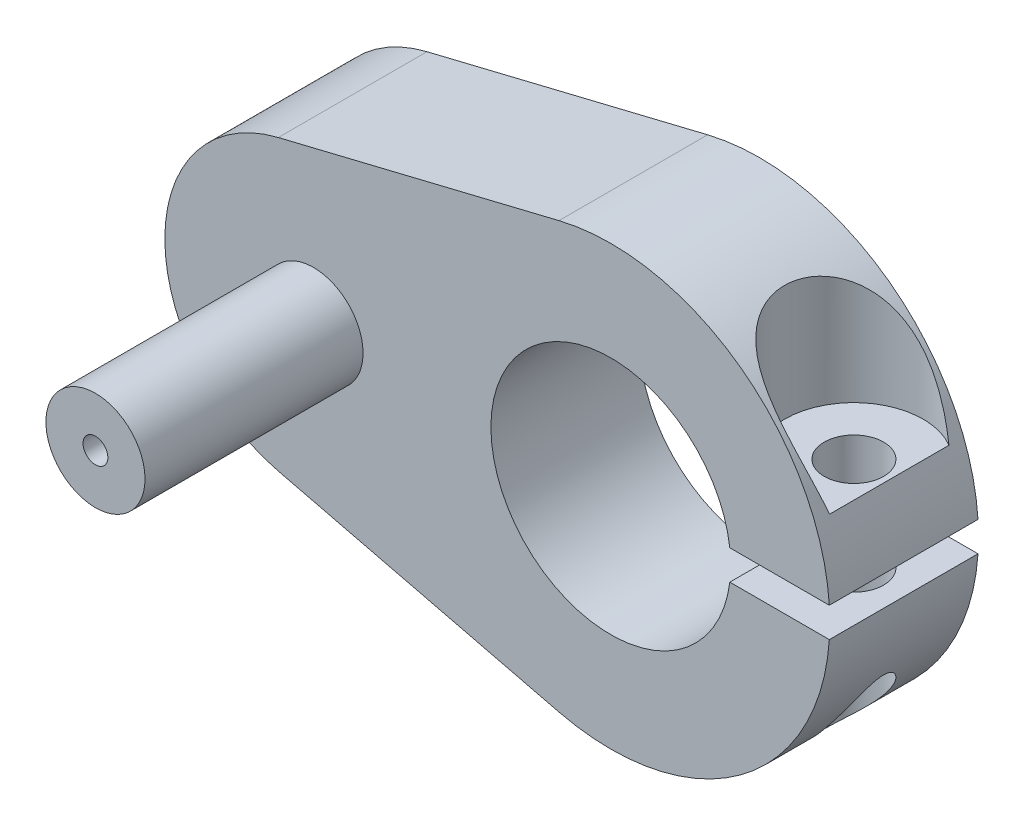
ISO-10303-21;
HEADER;
FILE_DESCRIPTION(('STEP AP214'),'2;1');
FILE_NAME('part.step','',(''),(''),'','','');
FILE_SCHEMA(('AUTOMOTIVE_DESIGN { 1 0 10303 214 1 1 1 1 }'));
ENDSEC;
DATA;
#1=APPLICATION_CONTEXT('core data for automotive mechanical design processes');
#2=APPLICATION_PROTOCOL_DEFINITION('international standard','automotive_design',2000,#1);
#3=PRODUCT_CONTEXT('',#1,'mechanical');
#4=PRODUCT('Part','Part','',(#3));
#5=PRODUCT_RELATED_PRODUCT_CATEGORY('part','',(#4));
#6=PRODUCT_DEFINITION_FORMATION('','',#4);
#7=PRODUCT_DEFINITION_CONTEXT('part definition',#1,'design');
#8=PRODUCT_DEFINITION('design','',#6,#7);
#9=PRODUCT_DEFINITION_SHAPE('','',#8);
#10=(LENGTH_UNIT() NAMED_UNIT(*) SI_UNIT(.MILLI.,.METRE.));
#11=(NAMED_UNIT(*) PLANE_ANGLE_UNIT() SI_UNIT($,.RADIAN.));
#12=(NAMED_UNIT(*) SI_UNIT($,.STERADIAN.) SOLID_ANGLE_UNIT());
#13=UNCERTAINTY_MEASURE_WITH_UNIT(LENGTH_MEASURE(1.E-05),#10,'distance_accuracy_value','');
#14=(GEOMETRIC_REPRESENTATION_CONTEXT(3) GLOBAL_UNCERTAINTY_ASSIGNED_CONTEXT((#13)) GLOBAL_UNIT_ASSIGNED_CONTEXT((#10,
#11,#12)) REPRESENTATION_CONTEXT('',''));
#15=CARTESIAN_POINT('',(0.,0.,0.));
#16=DIRECTION('',(0.,0.,1.));
#17=DIRECTION('',(1.,0.,0.));
#18=AXIS2_PLACEMENT_3D('',#15,#16,#17);
#19=CARTESIAN_POINT('',(0.,0.,-7.5));
#20=DIRECTION('',(0.,0.,1.));
#21=DIRECTION('',(1.,0.,0.));
#22=AXIS2_PLACEMENT_3D('',#19,#20,#21);
#23=CYLINDRICAL_SURFACE('',#22,11.05);
#24=CARTESIAN_POINT('',(0.,0.,0.));
#25=DIRECTION('',(0.,0.,1.));
#26=DIRECTION('',(1.,0.,0.));
#27=AXIS2_PLACEMENT_3D('',#24,#25,#26);
#28=CIRCLE('',#27,11.05);
#29=CARTESIAN_POINT('',(11.024518130059,0.75,0.));
#30=VERTEX_POINT('',#29);
#31=CARTESIAN_POINT('',(-2.61516666666667,10.7360795128182,0.));
#32=VERTEX_POINT('',#31);
#33=EDGE_CURVE('E169',#30,#32,#28,.T.);
#34=ORIENTED_EDGE('',*,*,#33,.F.);
#35=DIRECTION('',(0.,0.,1.));
#36=VECTOR('',#35,1.);
#37=CARTESIAN_POINT('',(11.024518130059,0.75,-7.5));
#38=LINE('',#37,#36);
#39=CARTESIAN_POINT('',(11.024518130059,0.75,-7.5));
#40=VERTEX_POINT('',#39);
#41=EDGE_CURVE('E60',#30,#40,#38,.F.);
#42=ORIENTED_EDGE('',*,*,#41,.T.);
#43=CARTESIAN_POINT('',(0.,0.,-7.5));
#44=DIRECTION('',(0.,0.,1.));
#45=DIRECTION('',(1.,0.,0.));
#46=AXIS2_PLACEMENT_3D('',#43,#44,#45);
#47=CIRCLE('',#46,11.05);
#48=CARTESIAN_POINT('',(-2.61516666666667,10.7360795128182,-7.5));
#49=VERTEX_POINT('',#48);
#50=EDGE_CURVE('E195',#40,#49,#47,.T.);
#51=ORIENTED_EDGE('',*,*,#50,.T.);
#52=DIRECTION('',(0.,0.,1.));
#53=VECTOR('',#52,1.);
#54=CARTESIAN_POINT('',(-2.61516666666667,10.7360795128182,-7.5));
#55=LINE('',#54,#53);
#56=EDGE_CURVE('E183',#49,#32,#55,.T.);
#57=ORIENTED_EDGE('',*,*,#56,.T.);
#58=EDGE_LOOP('',(#34,#42,#51,#57));
#59=FACE_BOUND('',#58,.T.);
#60=DIRECTION('',(0.,0.,1.));
#61=VECTOR('',#60,1.);
#62=CARTESIAN_POINT('',(10.3006067782437,4.,-7.5));
#63=LINE('',#62,#61);
#64=CARTESIAN_POINT('',(10.3006067782437,4.,-6.7596127964394));
#65=VERTEX_POINT('',#64);
#66=CARTESIAN_POINT('',(10.3006067782437,4.,-0.740387203560602));
#67=VERTEX_POINT('',#66);
#68=EDGE_CURVE('E46',#65,#67,#63,.T.);
#69=ORIENTED_EDGE('',*,*,#68,.T.);
#70=CARTESIAN_POINT('',(10.3006067782437,4.,-0.740387203560602));
#71=CARTESIAN_POINT('',(10.1963332133419,4.26846772193375,-0.678501030928572));
#72=CARTESIAN_POINT('',(10.0814411251191,4.53327440323441,-0.617619088764549));
#73=CARTESIAN_POINT('',(9.82985169091135,5.05580385530931,-0.503841767188244));
#74=CARTESIAN_POINT('',(9.69304533873154,5.31348323649118,-0.450989031556256));
#75=CARTESIAN_POINT('',(9.39590293925441,5.82303649722511,-0.35932622223754));
#76=CARTESIAN_POINT('',(9.23524249715496,6.07476375728232,-0.320740477228709));
#77=CARTESIAN_POINT('',(8.89295101377397,6.56559231672235,-0.266282914234312));
#78=CARTESIAN_POINT('',(8.71137387197074,6.80472385232601,-0.25035406774733));
#79=CARTESIAN_POINT('',(8.43314136231223,7.14167205303236,-0.249846946722727));
#80=CARTESIAN_POINT('',(8.3439220457835,7.24570367798232,-0.252940572722385));
#81=CARTESIAN_POINT('',(8.16190395445752,7.45013614310722,-0.266551538705841));
#82=CARTESIAN_POINT('',(8.06910500083609,7.55053680140705,-0.277069250022111));
#83=CARTESIAN_POINT('',(7.88076425074714,7.74690321355485,-0.306431892805582));
#84=CARTESIAN_POINT('',(7.78523166885842,7.84288154329846,-0.325251364816527));
#85=CARTESIAN_POINT('',(7.59190250630063,8.03016934689135,-0.3721656336608));
#86=CARTESIAN_POINT('',(7.49410641729134,8.12147982107978,-0.400258433479962));
#87=CARTESIAN_POINT('',(7.29575109574714,8.3001558566418,-0.467141062808042));
#88=CARTESIAN_POINT('',(7.19517237176104,8.38744406940937,-0.506081512330807));
#89=CARTESIAN_POINT('',(6.99393994896175,8.55596442917005,-0.595358858012029));
#90=CARTESIAN_POINT('',(6.89328624371162,8.63719597573479,-0.645696882078924));
#91=CARTESIAN_POINT('',(6.69364662735271,8.79281421398746,-0.758395829694695));
#92=CARTESIAN_POINT('',(6.59465854785767,8.86721047630164,-0.820739552134213));
#93=CARTESIAN_POINT('',(6.40015252285975,9.00860797277195,-0.957845181539791));
#94=CARTESIAN_POINT('',(6.30463287298117,9.07561287293522,-1.03260088583298));
#95=CARTESIAN_POINT('',(6.08362264050598,9.22583289205448,-1.22561226802914));
#96=CARTESIAN_POINT('',(5.96059902113282,9.30548119947955,-1.34958347334033));
#97=CARTESIAN_POINT('',(5.73100907724234,9.44861968557136,-1.6200173574957));
#98=CARTESIAN_POINT('',(5.62443597922442,9.51211652161988,-1.76647072950087));
#99=CARTESIAN_POINT('',(5.43293351052162,9.62278824530146,-2.0793048208288));
#100=CARTESIAN_POINT('',(5.3480799223035,9.66990618393145,-2.24575241371878));
#101=CARTESIAN_POINT('',(5.20520591760782,9.74756424783843,-2.59341839723659));
#102=CARTESIAN_POINT('',(5.14718299691194,9.77810592029388,-2.77463540751517));
#103=CARTESIAN_POINT('',(5.06387890662484,9.82149162015357,-3.13428554996573));
#104=CARTESIAN_POINT('',(5.03676941172862,9.83532713994846,-3.31217805211246));
#105=CARTESIAN_POINT('',(5.01022063454891,9.84887949976952,-3.67053401850726));
#106=CARTESIAN_POINT('',(5.01077603849675,9.84859905113718,-3.85099698237363));
#107=CARTESIAN_POINT('',(5.03918879056605,9.83408897566568,-4.20499535856626));
#108=CARTESIAN_POINT('',(5.06641984652411,9.82017933385366,-4.37859473659775));
#109=CARTESIAN_POINT('',(5.14599291325295,9.77871414784651,-4.7182170532735));
#110=CARTESIAN_POINT('',(5.19833279112503,9.7511597627139,-4.88424063414125));
#111=CARTESIAN_POINT('',(5.32603063731056,9.68200195100669,-5.20509446535952));
#112=CARTESIAN_POINT('',(5.40150931925267,9.64032472339426,-5.35986061904781));
#113=CARTESIAN_POINT('',(5.57184890790361,9.54288171385813,-5.65341745984955));
#114=CARTESIAN_POINT('',(5.66671095155563,9.48711510546761,-5.79220720911013));
#115=CARTESIAN_POINT('',(5.87534867131825,9.35939322163919,-6.05591147582207));
#116=CARTESIAN_POINT('',(5.98969819133461,9.28691134478283,-6.18011464176932));
#117=CARTESIAN_POINT('',(6.22947029469755,9.12780889620242,-6.4067878500048));
#118=CARTESIAN_POINT('',(6.35489605495274,9.04118426193879,-6.50925162809905));
#119=CARTESIAN_POINT('',(6.62429550648337,8.84598471515737,-6.70114194710916));
#120=CARTESIAN_POINT('',(6.76888968032143,8.73609699201461,-6.7883481655234));
#121=CARTESIAN_POINT('',(7.05987127774445,8.50267820789095,-6.93787267194385));
#122=CARTESIAN_POINT('',(7.20625962242817,8.37913985361127,-7.00017757272748));
#123=CARTESIAN_POINT('',(7.46349092176918,8.14993513610026,-7.09076897097035));
#124=CARTESIAN_POINT('',(7.57485954329306,8.04657750483244,-7.12356711666247));
#125=CARTESIAN_POINT('',(7.794715528216,7.8337928344841,-7.17717714277757));
#126=CARTESIAN_POINT('',(7.90320158907403,7.72436311833917,-7.19798368956093));
#127=CARTESIAN_POINT('',(8.11638931994332,7.50004843862677,-7.22902234389072));
#128=CARTESIAN_POINT('',(8.22108272337062,7.38515268936556,-7.2392325536804));
#129=CARTESIAN_POINT('',(8.42574490852837,7.15077279912297,-7.25038986440645));
#130=CARTESIAN_POINT('',(8.52571211831591,7.03128715515094,-7.25133390466563));
#131=CARTESIAN_POINT('',(8.77086307595103,6.72534635388551,-7.24368884936215));
#132=CARTESIAN_POINT('',(8.91263295136968,6.53627396664622,-7.22990604104272));
#133=CARTESIAN_POINT('',(9.18312318512603,6.15047541807691,-7.18815565662202));
#134=CARTESIAN_POINT('',(9.31183517561927,5.95374445925848,-7.16017905279757));
#135=CARTESIAN_POINT('',(9.55576161986383,5.55380919763809,-7.09373342122582));
#136=CARTESIAN_POINT('',(9.67097392013578,5.35060386859849,-7.05526272270235));
#137=CARTESIAN_POINT('',(9.88771646830462,4.93859582294843,-6.97121026519316));
#138=CARTESIAN_POINT('',(9.98925310963832,4.72979577701865,-6.92563185075538));
#139=CARTESIAN_POINT('',(10.1223478427757,4.43276282678958,-6.85882957183692));
#140=CARTESIAN_POINT('',(10.1596120414864,4.34667422091004,-6.83924160879398));
#141=CARTESIAN_POINT('',(10.2318199398004,4.17385990654398,-6.79967685392041));
#142=CARTESIAN_POINT('',(10.2667687701623,4.08713611435178,-6.77970105795282));
#143=CARTESIAN_POINT('',(10.3006067782437,4.,-6.7596127964394));
#144=B_SPLINE_CURVE_WITH_KNOTS('',3,(#70,#71,#72,#73,#74,#75,#76,#77,#78,#79,#80,#81,#82,#83,
#84,#85,#86,#87,#88,#89,#90,#91,#92,#93,#94,#95,#96,#97,#98,#99,#100,#101,#102,#103,#104,#105,
#106,#107,#108,#109,#110,#111,#112,#113,#114,#115,#116,#117,#118,#119,#120,#121,#122,#123,#124,
#125,#126,#127,#128,#129,#130,#131,#132,#133,#134,#135,#136,#137,#138,#139,#140,#141,#142,#143),
.UNSPECIFIED.,.F.,.F.,(4,2,2,2,2,2,2,2,2,2,2,2,2,2,2,2,2,2,2,2,2,2,2,2,2,2,2,2,2,2,2,2,2,2,2,2,
4),(0.,0.883871349332049,1.77228419343477,2.67412533724747,3.57369246213922,3.98470863055073,
4.39574535832529,4.80553020738345,5.21522686664953,5.63092300431096,6.04666029741849,
6.46180631782936,6.87674549721042,7.44997168515281,8.02296121402814,8.59792353994964,
9.17283219139759,9.71161452336512,10.2502933684682,10.7766209668136,11.302903863551,
11.8319804637491,12.3610881061789,12.9099469346544,13.4589637023832,14.0610953566382,
14.6635502894618,15.1292500639208,15.5951568134196,16.0620244722816,16.5290463354372,
17.2380850358988,17.9475752748363,18.6571785384778,19.3664488990481,19.6539180406218,
19.9407272419631),.UNSPECIFIED.);
#145=EDGE_CURVE('E11',#67,#65,#144,.T.);
#146=ORIENTED_EDGE('',*,*,#145,.T.);
#147=EDGE_LOOP('',(#69,#146));
#148=FACE_BOUND('',#147,.T.);
#149=ADVANCED_FACE('F32',(#59,#148),#23,.T.);
#150=CARTESIAN_POINT('',(0.,0.,-7.5));
#151=DIRECTION('',(0.,0.,1.));
#152=DIRECTION('',(1.,0.,0.));
#153=AXIS2_PLACEMENT_3D('',#150,#151,#152);
#154=CYLINDRICAL_SURFACE('',#153,6.05);
#155=DIRECTION('',(0.,0.,1.));
#156=VECTOR('',#155,1.);
#157=CARTESIAN_POINT('',(6.00333240792145,0.75,-7.5));
#158=LINE('',#157,#156);
#159=CARTESIAN_POINT('',(6.00333240792145,0.75,0.));
#160=VERTEX_POINT('',#159);
#161=CARTESIAN_POINT('',(6.00333240792145,0.75,-7.5));
#162=VERTEX_POINT('',#161);
#163=EDGE_CURVE('E221',#160,#162,#158,.F.);
#164=ORIENTED_EDGE('',*,*,#163,.F.);
#165=CARTESIAN_POINT('',(0.,0.,0.));
#166=DIRECTION('',(0.,0.,1.));
#167=DIRECTION('',(1.,0.,0.));
#168=AXIS2_PLACEMENT_3D('',#165,#166,#167);
#169=CIRCLE('',#168,6.05);
#170=CARTESIAN_POINT('',(6.00333240792145,-0.75,0.));
#171=VERTEX_POINT('',#170);
#172=EDGE_CURVE('E191',#160,#171,#169,.T.);
#173=ORIENTED_EDGE('',*,*,#172,.T.);
#174=DIRECTION('',(0.,0.,1.));
#175=VECTOR('',#174,1.);
#176=CARTESIAN_POINT('',(6.00333240792145,-0.75,-7.5));
#177=LINE('',#176,#175);
#178=CARTESIAN_POINT('',(6.00333240792145,-0.75,-7.5));
#179=VERTEX_POINT('',#178);
#180=EDGE_CURVE('E156',#171,#179,#177,.F.);
#181=ORIENTED_EDGE('',*,*,#180,.T.);
#182=CARTESIAN_POINT('',(0.,0.,-7.5));
#183=DIRECTION('',(0.,0.,1.));
#184=DIRECTION('',(1.,0.,0.));
#185=AXIS2_PLACEMENT_3D('',#182,#183,#184);
#186=CIRCLE('',#185,6.05);
#187=EDGE_CURVE('E178',#162,#179,#186,.T.);
#188=ORIENTED_EDGE('',*,*,#187,.F.);
#189=EDGE_LOOP('',(#164,#173,#181,#188));
#190=FACE_BOUND('',#189,.T.);
#191=ADVANCED_FACE('F34',(#190),#154,.F.);
#192=CARTESIAN_POINT('',(0.,0.,-7.5));
#193=DIRECTION('',(0.,0.,1.));
#194=DIRECTION('',(1.,0.,0.));
#195=AXIS2_PLACEMENT_3D('',#192,#193,#194);
#196=PLANE('',#195);
#197=DIRECTION('',(-1.,0.,0.));
#198=VECTOR('',#197,1.);
#199=CARTESIAN_POINT('',(0.,0.75,-7.5));
#200=LINE('',#199,#198);
#201=EDGE_CURVE('E157',#40,#162,#200,.T.);
#202=ORIENTED_EDGE('',*,*,#201,.T.);
#203=ORIENTED_EDGE('',*,*,#187,.T.);
#204=DIRECTION('',(-1.,0.,0.));
#205=VECTOR('',#204,1.);
#206=CARTESIAN_POINT('',(0.,-0.75,-7.5));
#207=LINE('',#206,#205);
#208=CARTESIAN_POINT('',(11.024518130059,-0.75,-7.5));
#209=VERTEX_POINT('',#208);
#210=EDGE_CURVE('E228',#209,#179,#207,.T.);
#211=ORIENTED_EDGE('',*,*,#210,.F.);
#212=CARTESIAN_POINT('',(-2.61516666666667,-10.7360795128182,-7.5));
#213=VERTEX_POINT('',#212);
#214=EDGE_CURVE('E153',#213,#209,#47,.T.);
#215=ORIENTED_EDGE('',*,*,#214,.F.);
#216=DIRECTION('',(0.971590906137397,-0.236666666666667,0.));
#217=VECTOR('',#216,1.);
#218=CARTESIAN_POINT('',(-2.61516666666667,-10.7360795128182,-7.5));
#219=LINE('',#218,#217);
#220=CARTESIAN_POINT('',(-16.775,-7.28693179603048,-7.5));
#221=VERTEX_POINT('',#220);
#222=EDGE_CURVE('E216',#221,#213,#219,.T.);
#223=ORIENTED_EDGE('',*,*,#222,.F.);
#224=CARTESIAN_POINT('',(-15.,0.,-7.5));
#225=DIRECTION('',(0.,0.,1.));
#226=DIRECTION('',(1.,0.,0.));
#227=AXIS2_PLACEMENT_3D('',#224,#225,#226);
#228=CIRCLE('',#227,7.5);
#229=CARTESIAN_POINT('',(-16.775,7.28693179603048,-7.5));
#230=VERTEX_POINT('',#229);
#231=EDGE_CURVE('E188',#230,#221,#228,.T.);
#232=ORIENTED_EDGE('',*,*,#231,.F.);
#233=DIRECTION('',(0.971590906137397,0.236666666666667,0.));
#234=VECTOR('',#233,1.);
#235=CARTESIAN_POINT('',(-2.61516666666667,10.7360795128182,-7.5));
#236=LINE('',#235,#234);
#237=EDGE_CURVE('E213',#230,#49,#236,.T.);
#238=ORIENTED_EDGE('',*,*,#237,.T.);
#239=ORIENTED_EDGE('',*,*,#50,.F.);
#240=EDGE_LOOP('',(#202,#203,#211,#215,#223,#232,#238,#239));
#241=FACE_BOUND('',#240,.T.);
#242=ADVANCED_FACE('F123',(#241),#196,.F.);
#243=CARTESIAN_POINT('',(0.,0.,0.));
#244=DIRECTION('',(0.,0.,1.));
#245=DIRECTION('',(1.,0.,0.));
#246=AXIS2_PLACEMENT_3D('',#243,#244,#245);
#247=PLANE('',#246);
#248=CARTESIAN_POINT('',(-15.,0.,0.));
#249=DIRECTION('',(0.,0.,1.));
#250=DIRECTION('',(1.,0.,0.));
#251=AXIS2_PLACEMENT_3D('',#248,#249,#250);
#252=CIRCLE('',#251,2.5);
#253=CARTESIAN_POINT('',(-12.5,0.,0.));
#254=VERTEX_POINT('',#253);
#255=EDGE_CURVE('E209',#254,#254,#252,.T.);
#256=ORIENTED_EDGE('',*,*,#255,.F.);
#257=EDGE_LOOP('',(#256));
#258=FACE_BOUND('',#257,.T.);
#259=ORIENTED_EDGE('',*,*,#172,.F.);
#260=DIRECTION('',(1.,0.,0.));
#261=VECTOR('',#260,1.);
#262=CARTESIAN_POINT('',(0.,0.75,0.));
#263=LINE('',#262,#261);
#264=EDGE_CURVE('E109',#160,#30,#263,.T.);
#265=ORIENTED_EDGE('',*,*,#264,.T.);
#266=ORIENTED_EDGE('',*,*,#33,.T.);
#267=DIRECTION('',(0.971590906137397,0.236666666666667,0.));
#268=VECTOR('',#267,1.);
#269=CARTESIAN_POINT('',(-2.61516666666667,10.7360795128182,0.));
#270=LINE('',#269,#268);
#271=CARTESIAN_POINT('',(-16.775,7.28693179603048,0.));
#272=VERTEX_POINT('',#271);
#273=EDGE_CURVE('E168',#272,#32,#270,.T.);
#274=ORIENTED_EDGE('',*,*,#273,.F.);
#275=CARTESIAN_POINT('',(-15.,0.,0.));
#276=DIRECTION('',(0.,0.,1.));
#277=DIRECTION('',(1.,0.,0.));
#278=AXIS2_PLACEMENT_3D('',#275,#276,#277);
#279=CIRCLE('',#278,7.5);
#280=CARTESIAN_POINT('',(-16.775,-7.28693179603048,0.));
#281=VERTEX_POINT('',#280);
#282=EDGE_CURVE('E172',#272,#281,#279,.T.);
#283=ORIENTED_EDGE('',*,*,#282,.T.);
#284=DIRECTION('',(0.971590906137397,-0.236666666666667,0.));
#285=VECTOR('',#284,1.);
#286=CARTESIAN_POINT('',(-2.61516666666667,-10.7360795128182,0.));
#287=LINE('',#286,#285);
#288=CARTESIAN_POINT('',(-2.61516666666667,-10.7360795128182,0.));
#289=VERTEX_POINT('',#288);
#290=EDGE_CURVE('E167',#281,#289,#287,.T.);
#291=ORIENTED_EDGE('',*,*,#290,.T.);
#292=CARTESIAN_POINT('',(11.024518130059,-0.75,0.));
#293=VERTEX_POINT('',#292);
#294=EDGE_CURVE('E150',#289,#293,#28,.T.);
#295=ORIENTED_EDGE('',*,*,#294,.T.);
#296=DIRECTION('',(1.,0.,0.));
#297=VECTOR('',#296,1.);
#298=CARTESIAN_POINT('',(0.,-0.75,0.));
#299=LINE('',#298,#297);
#300=EDGE_CURVE('E163',#171,#293,#299,.T.);
#301=ORIENTED_EDGE('',*,*,#300,.F.);
#302=EDGE_LOOP('',(#259,#265,#266,#274,#283,#291,#295,#301));
#303=FACE_BOUND('',#302,.T.);
#304=ADVANCED_FACE('F162',(#258,#303),#247,.T.);
#305=CARTESIAN_POINT('',(-2.61516666666667,-10.7360795128182,-7.5));
#306=DIRECTION('',(-0.236666666666667,-0.971590906137397,0.));
#307=DIRECTION('',(0.971590906137397,-0.236666666666667,0.));
#308=AXIS2_PLACEMENT_3D('',#305,#306,#307);
#309=PLANE('',#308);
#310=ORIENTED_EDGE('',*,*,#290,.F.);
#311=DIRECTION('',(0.,0.,1.));
#312=VECTOR('',#311,1.);
#313=CARTESIAN_POINT('',(-16.775,-7.28693179603048,-7.5));
#314=LINE('',#313,#312);
#315=EDGE_CURVE('E179',#221,#281,#314,.T.);
#316=ORIENTED_EDGE('',*,*,#315,.F.);
#317=ORIENTED_EDGE('',*,*,#222,.T.);
#318=DIRECTION('',(0.,0.,1.));
#319=VECTOR('',#318,1.);
#320=CARTESIAN_POINT('',(-2.61516666666667,-10.7360795128182,-7.5));
#321=LINE('',#320,#319);
#322=EDGE_CURVE('E186',#213,#289,#321,.T.);
#323=ORIENTED_EDGE('',*,*,#322,.T.);
#324=EDGE_LOOP('',(#310,#316,#317,#323));
#325=FACE_BOUND('',#324,.T.);
#326=ADVANCED_FACE('F205',(#325),#309,.T.);
#327=CARTESIAN_POINT('',(-15.,0.,-7.5));
#328=DIRECTION('',(0.,0.,1.));
#329=DIRECTION('',(1.,0.,0.));
#330=AXIS2_PLACEMENT_3D('',#327,#328,#329);
#331=CYLINDRICAL_SURFACE('',#330,7.5);
#332=ORIENTED_EDGE('',*,*,#282,.F.);
#333=DIRECTION('',(0.,0.,1.));
#334=VECTOR('',#333,1.);
#335=CARTESIAN_POINT('',(-16.775,7.28693179603048,-7.5));
#336=LINE('',#335,#334);
#337=EDGE_CURVE('E181',#230,#272,#336,.T.);
#338=ORIENTED_EDGE('',*,*,#337,.F.);
#339=ORIENTED_EDGE('',*,*,#231,.T.);
#340=ORIENTED_EDGE('',*,*,#315,.T.);
#341=EDGE_LOOP('',(#332,#338,#339,#340));
#342=FACE_BOUND('',#341,.T.);
#343=ADVANCED_FACE('F140',(#342),#331,.T.);
#344=CARTESIAN_POINT('',(-2.61516666666667,10.7360795128182,-7.5));
#345=DIRECTION('',(0.236666666666667,-0.971590906137397,0.));
#346=DIRECTION('',(0.971590906137397,0.236666666666667,0.));
#347=AXIS2_PLACEMENT_3D('',#344,#345,#346);
#348=PLANE('',#347);
#349=ORIENTED_EDGE('',*,*,#273,.T.);
#350=ORIENTED_EDGE('',*,*,#56,.F.);
#351=ORIENTED_EDGE('',*,*,#237,.F.);
#352=ORIENTED_EDGE('',*,*,#337,.T.);
#353=EDGE_LOOP('',(#349,#350,#351,#352));
#354=FACE_BOUND('',#353,.T.);
#355=ADVANCED_FACE('F130',(#354),#348,.F.);
#356=CARTESIAN_POINT('',(8.51392526899023,-7.04383251604192,-2.25));
#357=CARTESIAN_POINT('',(8.45885143709515,-7.11040074238383,-2.2500002769527));
#358=CARTESIAN_POINT('',(8.40299388117364,-7.17632364915005,-2.25302881059126));
#359=CARTESIAN_POINT('',(8.29005179063583,-7.30650156550169,-2.26571210946883));
#360=CARTESIAN_POINT('',(8.23296706204719,-7.37075630781301,-2.27536792981773));
#361=CARTESIAN_POINT('',(8.11822174698821,-7.49694777178513,-2.30194000147599));
#362=CARTESIAN_POINT('',(8.06056298085226,-7.55888994218635,-2.31883783882574));
#363=CARTESIAN_POINT('',(7.94524793657129,-7.68000820943499,-2.36062408920886));
#364=CARTESIAN_POINT('',(7.88759166462692,-7.73918526741274,-2.38550970172929));
#365=CARTESIAN_POINT('',(7.76237822129186,-7.86493823511058,-2.44960885129153));
#366=CARTESIAN_POINT('',(7.69500976607417,-7.93079810215335,-2.4906416117784));
#367=CARTESIAN_POINT('',(7.56391455553743,-8.05592228042523,-2.58636435673905));
#368=CARTESIAN_POINT('',(7.50018362530637,-8.11519423002788,-2.64103828104801));
#369=CARTESIAN_POINT('',(7.39041745663418,-8.2151519710856,-2.75363327224506));
#370=CARTESIAN_POINT('',(7.34326449384416,-8.25726148059279,-2.80918703334273));
#371=CARTESIAN_POINT('',(7.25577002116971,-8.33424813262966,-2.92988912840613));
#372=CARTESIAN_POINT('',(7.21542136866483,-8.36913286803761,-2.99502726521307));
#373=CARTESIAN_POINT('',(7.14965235502403,-8.42535155388136,-3.12302858708222));
#374=CARTESIAN_POINT('',(7.12288210372966,-8.44795391233622,-3.18463765917239));
#375=CARTESIAN_POINT('',(7.07742780842057,-8.48607096076293,-3.31285846746514));
#376=CARTESIAN_POINT('',(7.0587404311208,-8.50158857255048,-3.37946812815702));
#377=CARTESIAN_POINT('',(7.03060073020498,-8.52487511511992,-3.51624492836675));
#378=CARTESIAN_POINT('',(7.02118738123584,-8.53261134702347,-3.5864257888864));
#379=CARTESIAN_POINT('',(7.01241854945923,-8.53981977980829,-3.72783451827899));
#380=CARTESIAN_POINT('',(7.01306089221421,-8.5392937673129,-3.79906215746899));
#381=CARTESIAN_POINT('',(7.02392494088749,-8.53035854788431,-3.9349348787981));
#382=CARTESIAN_POINT('',(7.03343635522826,-8.52253385071926,-3.99967788315913));
#383=CARTESIAN_POINT('',(7.06043889534695,-8.5001768745238,-4.12625263452983));
#384=CARTESIAN_POINT('',(7.07792987210567,-8.48564472075583,-4.18808443588274));
#385=CARTESIAN_POINT('',(7.12048203261166,-8.44997158170318,-4.30905146902268));
#386=CARTESIAN_POINT('',(7.14573437671707,-8.42866317761834,-4.36806925879988));
#387=CARTESIAN_POINT('',(7.20233953568312,-8.38034556793926,-4.48055865302655));
#388=CARTESIAN_POINT('',(7.23369532823927,-8.35333357918402,-4.5340275307222));
#389=CARTESIAN_POINT('',(7.31411182215683,-8.28311988601621,-4.65414251094268));
#390=CARTESIAN_POINT('',(7.36536030379982,-8.23767535943789,-4.71802022096587));
#391=CARTESIAN_POINT('',(7.47388240477446,-8.13934744544155,-4.83380722489499));
#392=CARTESIAN_POINT('',(7.53116706555934,-8.08645036401463,-4.8856940114579));
#393=CARTESIAN_POINT('',(7.66982231089328,-7.95539129595612,-4.99406661543656));
#394=CARTESIAN_POINT('',(7.75262218165845,-7.87485431453279,-5.04583888071635));
#395=CARTESIAN_POINT('',(7.92009761295807,-7.70641182576768,-5.13065523225161));
#396=CARTESIAN_POINT('',(8.0047754256128,-7.61849707505751,-5.1636754100983));
#397=CARTESIAN_POINT('',(8.2089285586291,-7.39910694571982,-5.22397973533403));
#398=CARTESIAN_POINT('',(8.32798001176351,-7.26492914258099,-5.24293668292237));
#399=CARTESIAN_POINT('',(8.50178595666302,-7.05906221657247,-5.25107509270742));
#400=CARTESIAN_POINT('',(8.55903057800155,-6.98953628864543,-5.25038425484725));
#401=CARTESIAN_POINT('',(8.67164423348774,-6.84931646584088,-5.24275161163478));
#402=CARTESIAN_POINT('',(8.72701378984024,-6.77862290444561,-5.23581156179048));
#403=CARTESIAN_POINT('',(8.85091387931118,-6.61641708413988,-5.21336770445468));
#404=CARTESIAN_POINT('',(8.91876411025368,-6.52464365377954,-5.19600378875766));
#405=CARTESIAN_POINT('',(9.05066004265112,-6.34041738827607,-5.15240614134135));
#406=CARTESIAN_POINT('',(9.11470382691572,-6.24796423668305,-5.12616798371166));
#407=CARTESIAN_POINT('',(9.23849164692942,-6.06342138866937,-5.06519985369746));
#408=CARTESIAN_POINT('',(9.29824827666942,-5.97133144766557,-5.03049619264913));
#409=CARTESIAN_POINT('',(9.41336337112677,-5.78815789349706,-4.95243524362374));
#410=CARTESIAN_POINT('',(9.46872521525001,-5.69707355439225,-4.90908469664076));
#411=CARTESIAN_POINT('',(9.56551732756194,-5.53270553201656,-4.82128425151722));
#412=CARTESIAN_POINT('',(9.60769942366235,-5.45907209671103,-4.7783263161783));
#413=CARTESIAN_POINT('',(9.68852579815457,-5.31430677097443,-4.68495571835263));
#414=CARTESIAN_POINT('',(9.72716152496336,-5.24318116944318,-4.63452576525041));
#415=CARTESIAN_POINT('',(9.80056458715759,-5.10466462192141,-4.52397454847189));
#416=CARTESIAN_POINT('',(9.83527733783281,-5.03733169261484,-4.46373968673236));
#417=CARTESIAN_POINT('',(9.88265772285615,-4.94336146542688,-4.36472744408291));
#418=CARTESIAN_POINT('',(9.89764415650865,-4.91326333203371,-4.33035812964299));
#419=CARTESIAN_POINT('',(9.92569857625359,-4.85633660511059,-4.25832152292475));
#420=CARTESIAN_POINT('',(9.93876956335214,-4.82950290850877,-4.22065954048998));
#421=CARTESIAN_POINT('',(9.96089138860941,-4.78369146930482,-4.1469438386543));
#422=CARTESIAN_POINT('',(9.97024564807371,-4.76414360671125,-4.11134171559237));
#423=CARTESIAN_POINT('',(9.98661850934686,-4.7297266789707,-4.0374103336048));
#424=CARTESIAN_POINT('',(9.99363879754632,-4.71485423606466,-3.99908306811966));
#425=CARTESIAN_POINT('',(10.0048430591712,-4.69103347070355,-3.91966467125555));
#426=CARTESIAN_POINT('',(10.0089926805319,-4.68215692731455,-3.8785463211818));
#427=CARTESIAN_POINT('',(10.0138226782727,-4.67181897044442,-3.7951941148331));
#428=CARTESIAN_POINT('',(10.0145073329827,-4.67034841251421,-3.75296169897282));
#429=CARTESIAN_POINT('',(10.0124548601957,-4.67474583548627,-3.67388599986213));
#430=CARTESIAN_POINT('',(10.0101028364472,-4.67978793143638,-3.63698235730477));
#431=CARTESIAN_POINT('',(10.0028661715567,-4.69523588158506,-3.56457547779849));
#432=CARTESIAN_POINT('',(9.99797914385445,-4.70564679015746,-3.52907359447744));
#433=CARTESIAN_POINT('',(9.98361181160478,-4.73607193962776,-3.44592658127176));
#434=CARTESIAN_POINT('',(9.97306956268181,-4.75827385547116,-3.39927669803089));
#435=CARTESIAN_POINT('',(9.94879314174623,-4.8088253066776,-3.31034766439508));
#436=CARTESIAN_POINT('',(9.93505048796295,-4.83719116422657,-3.26808056724315));
#437=CARTESIAN_POINT('',(9.90688335134493,-4.89459571131063,-3.19222732133173));
#438=CARTESIAN_POINT('',(9.89271491516414,-4.92318958192876,-3.15820077735537));
#439=CARTESIAN_POINT('',(9.86285557754796,-4.98273967883276,-3.09298224302701));
#440=CARTESIAN_POINT('',(9.84716344696263,-5.01369780797341,-3.06179258110423));
#441=CARTESIAN_POINT('',(9.79813001585384,-5.10923165944231,-2.97185712396251));
#442=CARTESIAN_POINT('',(9.7628812779174,-5.17636466776977,-2.91687050420293));
#443=CARTESIAN_POINT('',(9.68881077581002,-5.31371045398531,-2.8153645682277));
#444=CARTESIAN_POINT('',(9.65002141113889,-5.38389272698576,-2.76877818963695));
#445=CARTESIAN_POINT('',(9.56908996976135,-5.52645821747714,-2.68222793175076));
#446=CARTESIAN_POINT('',(9.52694490672072,-5.59884335916811,-2.64227005107856));
#447=CARTESIAN_POINT('',(9.43960893031091,-5.74487012276151,-2.5683130982106));
#448=CARTESIAN_POINT('',(9.39441581455396,-5.81851262385109,-2.53431840001321));
#449=CARTESIAN_POINT('',(9.30119579182311,-5.96639750161303,-2.47197491685742));
#450=CARTESIAN_POINT('',(9.25316853770279,-6.04063995080627,-2.44362682540602));
#451=CARTESIAN_POINT('',(9.15177759231074,-6.19324663164262,-2.39111209547285));
#452=CARTESIAN_POINT('',(9.09826582664141,-6.27161803617524,-2.3672518880675));
#453=CARTESIAN_POINT('',(8.98841661311016,-6.42806378361959,-2.32581473115998));
#454=CARTESIAN_POINT('',(8.93207872408085,-6.50613807809205,-2.30823876615156));
#455=CARTESIAN_POINT('',(8.81678835102927,-6.66153892109442,-2.27969407183023));
#456=CARTESIAN_POINT('',(8.7578365304373,-6.73886565335949,-2.26872367617676));
#457=CARTESIAN_POINT('',(8.63756578358912,-6.89234773118466,-2.25387717478352));
#458=CARTESIAN_POINT('',(8.57624732098369,-6.96850330214056,-2.2499996865978));
#459=CARTESIAN_POINT('',(8.51392526899023,-7.04383251604192,-2.25));
#460=B_SPLINE_CURVE_WITH_KNOTS('',3,(#356,#357,#358,#359,#360,#361,#362,#363,#364,#365,#366,
#367,#368,#369,#370,#371,#372,#373,#374,#375,#376,#377,#378,#379,#380,#381,#382,#383,#384,#385,
#386,#387,#388,#389,#390,#391,#392,#393,#394,#395,#396,#397,#398,#399,#400,#401,#402,#403,#404,
#405,#406,#407,#408,#409,#410,#411,#412,#413,#414,#415,#416,#417,#418,#419,#420,#421,#422,#423,
#424,#425,#426,#427,#428,#429,#430,#431,#432,#433,#434,#435,#436,#437,#438,#439,#440,#441,#442,
#443,#444,#445,#446,#447,#448,#449,#450,#451,#452,#453,#454,#455,#456,#457,#458,#459),
.UNSPECIFIED.,.T.,.F.,(4,2,2,2,2,2,2,2,2,2,2,2,2,2,2,2,2,2,2,2,2,2,2,2,2,2,2,2,2,2,2,2,2,2,2,2,
2,2,2,2,2,2,2,2,2,2,2,2,2,2,2,4),(0.,0.259124892954306,0.518291049956622,0.776802110017274,
1.03522263495015,1.34249433862368,1.64940597490185,1.90092131025387,2.15217095891748,
2.36389585111857,2.57553334694822,2.78805651532732,3.00053372844209,3.19733372313962,
3.39413004272593,3.59622548078899,3.7984197636013,4.07785006954048,4.35780069039895,
4.73544302202485,5.11356576272047,5.65155120830575,5.92157510367431,6.19152316847821,
6.53742426351879,6.88349812715323,7.22850977708273,7.57325350454069,7.85826376993837,
8.14394417263521,8.43320698111915,8.57725766723337,8.7210801934614,8.84578642747563,
8.97040235926069,9.09648485860532,9.2224116409068,9.33383163788622,9.44535672126736,
9.60264722447895,9.76035942353123,9.90010406703809,10.0399623928942,10.3201820522404,
10.5980546675627,10.8761773947112,11.154503279698,11.4328633271657,11.726176699673,
12.0195360027433,12.3128212710861,12.6060493704539),.UNSPECIFIED.);
#461=CARTESIAN_POINT('',(8.51392526899023,-7.04383251604192,-2.25));
#462=VERTEX_POINT('',#461);
#463=EDGE_CURVE('E113',#462,#462,#460,.T.);
#464=ORIENTED_EDGE('',*,*,#463,.F.);
#465=EDGE_LOOP('',(#464));
#466=FACE_BOUND('',#465,.T.);
#467=DIRECTION('',(0.,0.,1.));
#468=VECTOR('',#467,1.);
#469=CARTESIAN_POINT('',(11.024518130059,-0.75,-7.5));
#470=LINE('',#469,#468);
#471=EDGE_CURVE('E148',#293,#209,#470,.F.);
#472=ORIENTED_EDGE('',*,*,#471,.F.);
#473=ORIENTED_EDGE('',*,*,#294,.F.);
#474=ORIENTED_EDGE('',*,*,#322,.F.);
#475=ORIENTED_EDGE('',*,*,#214,.T.);
#476=EDGE_LOOP('',(#472,#473,#474,#475));
#477=FACE_BOUND('',#476,.T.);
#478=ADVANCED_FACE('F117',(#466,#477),#23,.T.);
#479=CARTESIAN_POINT('',(-15.,0.,11.));
#480=DIRECTION('',(0.,0.,-1.));
#481=DIRECTION('',(-1.,0.,0.));
#482=AXIS2_PLACEMENT_3D('',#479,#480,#481);
#483=CYLINDRICAL_SURFACE('',#482,2.5);
#484=CARTESIAN_POINT('',(-15.,0.,11.));
#485=DIRECTION('',(0.,0.,1.));
#486=DIRECTION('',(1.,0.,0.));
#487=AXIS2_PLACEMENT_3D('',#484,#485,#486);
#488=CIRCLE('',#487,2.5);
#489=CARTESIAN_POINT('',(-12.5,0.,11.));
#490=VERTEX_POINT('',#489);
#491=EDGE_CURVE('E206',#490,#490,#488,.T.);
#492=ORIENTED_EDGE('',*,*,#491,.F.);
#493=EDGE_LOOP('',(#492));
#494=FACE_BOUND('',#493,.T.);
#495=ORIENTED_EDGE('',*,*,#255,.T.);
#496=EDGE_LOOP('',(#495));
#497=FACE_BOUND('',#496,.T.);
#498=ADVANCED_FACE('F129',(#494,#497),#483,.T.);
#499=CARTESIAN_POINT('',(-15.,0.,11.));
#500=DIRECTION('',(0.,0.,1.));
#501=DIRECTION('',(1.,0.,0.));
#502=AXIS2_PLACEMENT_3D('',#499,#500,#501);
#503=PLANE('',#502);
#504=CARTESIAN_POINT('',(-15.,0.,11.));
#505=DIRECTION('',(0.,0.,1.));
#506=DIRECTION('',(1.,0.,0.));
#507=AXIS2_PLACEMENT_3D('',#504,#505,#506);
#508=CIRCLE('',#507,0.625000000000001);
#509=CARTESIAN_POINT('',(-14.375,0.,11.));
#510=VERTEX_POINT('',#509);
#511=EDGE_CURVE('E112',#510,#510,#508,.T.);
#512=ORIENTED_EDGE('',*,*,#511,.F.);
#513=EDGE_LOOP('',(#512));
#514=FACE_BOUND('',#513,.T.);
#515=ORIENTED_EDGE('',*,*,#491,.T.);
#516=EDGE_LOOP('',(#515));
#517=FACE_BOUND('',#516,.T.);
#518=ADVANCED_FACE('F136',(#514,#517),#503,.T.);
#519=CARTESIAN_POINT('',(0.,-0.75,0.));
#520=DIRECTION('',(0.,-1.,0.));
#521=DIRECTION('',(0.,0.,-1.));
#522=AXIS2_PLACEMENT_3D('',#519,#520,#521);
#523=PLANE('',#522);
#524=CARTESIAN_POINT('',(8.51392526899023,-0.750000000000001,-3.75));
#525=DIRECTION('',(0.,-1.,0.));
#526=DIRECTION('',(0.,0.,-1.));
#527=AXIS2_PLACEMENT_3D('',#524,#525,#526);
#528=CIRCLE('',#527,1.5);
#529=CARTESIAN_POINT('',(8.51392526899023,-0.750000000000001,-5.25));
#530=VERTEX_POINT('',#529);
#531=EDGE_CURVE('E240',#530,#530,#528,.T.);
#532=ORIENTED_EDGE('',*,*,#531,.T.);
#533=EDGE_LOOP('',(#532));
#534=FACE_BOUND('',#533,.T.);
#535=ORIENTED_EDGE('',*,*,#300,.T.);
#536=ORIENTED_EDGE('',*,*,#471,.T.);
#537=ORIENTED_EDGE('',*,*,#210,.T.);
#538=ORIENTED_EDGE('',*,*,#180,.F.);
#539=EDGE_LOOP('',(#535,#536,#537,#538));
#540=FACE_BOUND('',#539,.T.);
#541=ADVANCED_FACE('F262',(#534,#540),#523,.F.);
#542=CARTESIAN_POINT('',(0.,0.75,0.));
#543=DIRECTION('',(0.,-1.,0.));
#544=DIRECTION('',(0.,0.,-1.));
#545=AXIS2_PLACEMENT_3D('',#542,#543,#544);
#546=PLANE('',#545);
#547=CARTESIAN_POINT('',(8.51392526899023,0.750000000000001,-3.75));
#548=DIRECTION('',(0.,-1.,0.));
#549=DIRECTION('',(0.,0.,-1.));
#550=AXIS2_PLACEMENT_3D('',#547,#548,#549);
#551=CIRCLE('',#550,1.5);
#552=CARTESIAN_POINT('',(8.51392526899023,0.750000000000001,-5.25));
#553=VERTEX_POINT('',#552);
#554=EDGE_CURVE('E376',#553,#553,#551,.T.);
#555=ORIENTED_EDGE('',*,*,#554,.F.);
#556=EDGE_LOOP('',(#555));
#557=FACE_BOUND('',#556,.T.);
#558=ORIENTED_EDGE('',*,*,#163,.T.);
#559=ORIENTED_EDGE('',*,*,#201,.F.);
#560=ORIENTED_EDGE('',*,*,#41,.F.);
#561=ORIENTED_EDGE('',*,*,#264,.F.);
#562=EDGE_LOOP('',(#558,#559,#560,#561));
#563=FACE_BOUND('',#562,.T.);
#564=ADVANCED_FACE('F260',(#557,#563),#546,.T.);
#565=CARTESIAN_POINT('',(-15.,0.,0.999999999999999));
#566=DIRECTION('',(0.,0.,1.));
#567=DIRECTION('',(1.,0.,0.));
#568=AXIS2_PLACEMENT_3D('',#565,#566,#567);
#569=CYLINDRICAL_SURFACE('',#568,0.625000000000001);
#570=CARTESIAN_POINT('',(-15.,0.,0.999999999999999));
#571=DIRECTION('',(0.,0.,1.));
#572=DIRECTION('',(1.,0.,0.));
#573=AXIS2_PLACEMENT_3D('',#570,#571,#572);
#574=CIRCLE('',#573,0.625000000000001);
#575=CARTESIAN_POINT('',(-14.375,0.,0.999999999999999));
#576=VERTEX_POINT('',#575);
#577=EDGE_CURVE('E230',#576,#576,#574,.T.);
#578=ORIENTED_EDGE('',*,*,#577,.F.);
#579=EDGE_LOOP('',(#578));
#580=FACE_BOUND('',#579,.T.);
#581=ORIENTED_EDGE('',*,*,#511,.T.);
#582=EDGE_LOOP('',(#581));
#583=FACE_BOUND('',#582,.T.);
#584=ADVANCED_FACE('F256',(#580,#583),#569,.F.);
#585=CARTESIAN_POINT('',(-15.,0.,0.999999999999999));
#586=DIRECTION('',(0.,0.,1.));
#587=DIRECTION('',(1.,0.,0.));
#588=AXIS2_PLACEMENT_3D('',#585,#586,#587);
#589=PLANE('',#588);
#590=ORIENTED_EDGE('',*,*,#577,.T.);
#591=EDGE_LOOP('',(#590));
#592=FACE_BOUND('',#591,.T.);
#593=ADVANCED_FACE('F253',(#592),#589,.T.);
#594=CARTESIAN_POINT('',(8.51392526899023,11.05,-3.75));
#595=DIRECTION('',(0.,-1.,0.));
#596=DIRECTION('',(0.,0.,-1.));
#597=AXIS2_PLACEMENT_3D('',#594,#595,#596);
#598=CYLINDRICAL_SURFACE('',#597,3.5);
#599=CARTESIAN_POINT('',(8.51392526899023,4.,-3.75));
#600=DIRECTION('',(0.,1.,0.));
#601=DIRECTION('',(0.,0.,1.));
#602=AXIS2_PLACEMENT_3D('',#599,#600,#601);
#603=CIRCLE('',#602,3.5);
#604=EDGE_CURVE('E52',#65,#67,#603,.T.);
#605=ORIENTED_EDGE('',*,*,#604,.F.);
#606=ORIENTED_EDGE('',*,*,#145,.F.);
#607=EDGE_LOOP('',(#605,#606));
#608=FACE_BOUND('',#607,.T.);
#609=ADVANCED_FACE('F111',(#608),#598,.F.);
#610=CARTESIAN_POINT('',(8.51392526899023,4.,-3.75));
#611=DIRECTION('',(0.,1.,0.));
#612=DIRECTION('',(0.,0.,1.));
#613=AXIS2_PLACEMENT_3D('',#610,#611,#612);
#614=PLANE('',#613);
#615=CARTESIAN_POINT('',(8.51392526899023,4.,-3.75));
#616=DIRECTION('',(0.,1.,0.));
#617=DIRECTION('',(0.,0.,1.));
#618=AXIS2_PLACEMENT_3D('',#615,#616,#617);
#619=CIRCLE('',#618,1.5);
#620=CARTESIAN_POINT('',(8.51392526899023,4.,-2.25));
#621=VERTEX_POINT('',#620);
#622=EDGE_CURVE('E378',#621,#621,#619,.T.);
#623=ORIENTED_EDGE('',*,*,#622,.F.);
#624=EDGE_LOOP('',(#623));
#625=FACE_BOUND('',#624,.T.);
#626=ORIENTED_EDGE('',*,*,#604,.T.);
#627=ORIENTED_EDGE('',*,*,#68,.F.);
#628=EDGE_LOOP('',(#626,#627));
#629=FACE_BOUND('',#628,.T.);
#630=ADVANCED_FACE('F107',(#625,#629),#614,.T.);
#631=CARTESIAN_POINT('',(8.51392526899023,-11.05,-3.75));
#632=DIRECTION('',(0.,1.,0.));
#633=DIRECTION('',(0.,0.,1.));
#634=AXIS2_PLACEMENT_3D('',#631,#632,#633);
#635=CYLINDRICAL_SURFACE('',#634,1.5);
#636=ORIENTED_EDGE('',*,*,#554,.T.);
#637=EDGE_LOOP('',(#636));
#638=FACE_BOUND('',#637,.T.);
#639=ORIENTED_EDGE('',*,*,#622,.T.);
#640=EDGE_LOOP('',(#639));
#641=FACE_BOUND('',#640,.T.);
#642=ADVANCED_FACE('F242',(#638,#641),#635,.F.);
#643=ORIENTED_EDGE('',*,*,#463,.T.);
#644=EDGE_LOOP('',(#643));
#645=FACE_BOUND('',#644,.T.);
#646=ORIENTED_EDGE('',*,*,#531,.F.);
#647=EDGE_LOOP('',(#646));
#648=FACE_BOUND('',#647,.T.);
#649=ADVANCED_FACE('F246',(#645,#648),#635,.F.);
#650=CLOSED_SHELL('',(#149,#191,#242,#304,#326,#343,#355,#478,#498,#518,#541,#564,#584,#593,
#609,#630,#642,#649));
#651=MANIFOLD_SOLID_BREP('B2',#650);
#652=ADVANCED_BREP_SHAPE_REPRESENTATION('',(#18,#651),#14);
#653=SHAPE_DEFINITION_REPRESENTATION(#9,#652);
ENDSEC;
END-ISO-10303-21;
